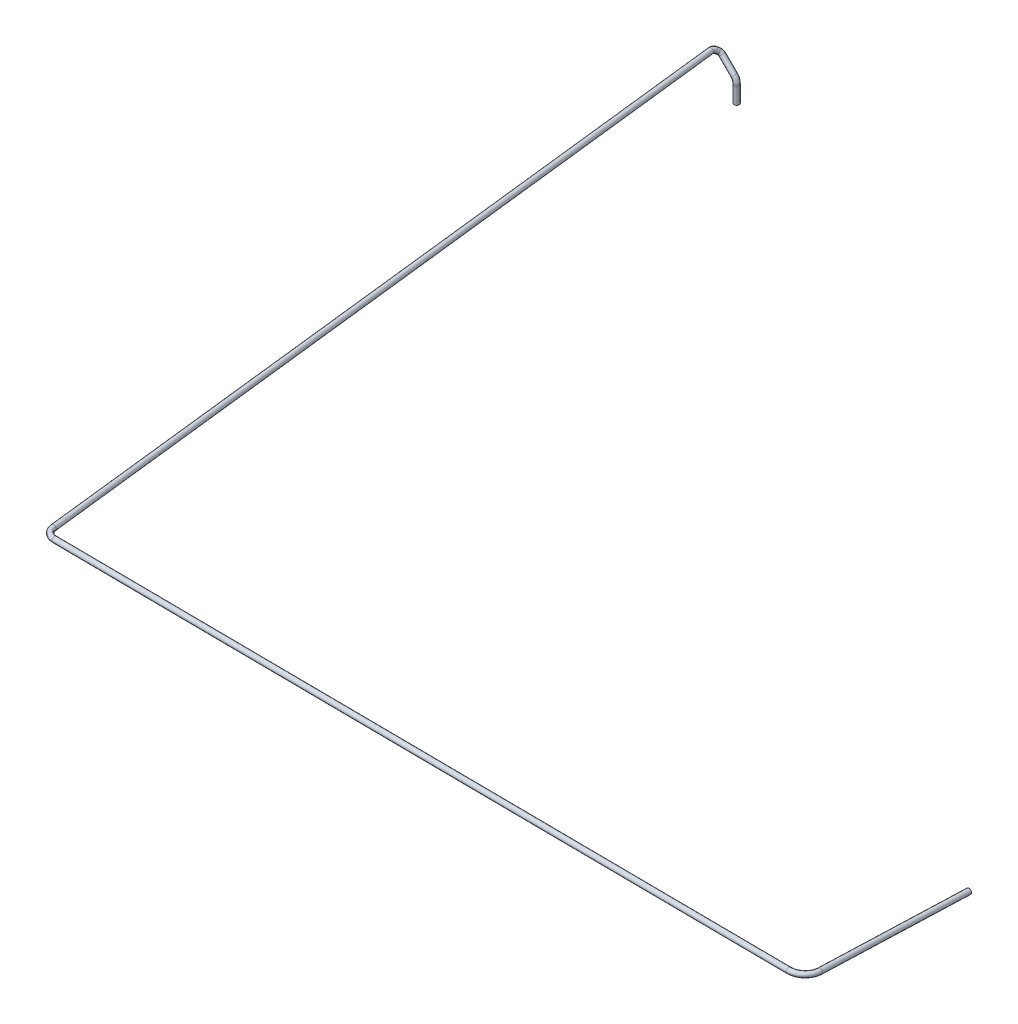
ISO-10303-21;
HEADER;
FILE_DESCRIPTION(('STEP AP214'),'2;1');
FILE_NAME('part.step','',(''),(''),'','','');
FILE_SCHEMA(('AUTOMOTIVE_DESIGN { 1 0 10303 214 1 1 1 1 }'));
ENDSEC;
DATA;
#1=APPLICATION_CONTEXT('core data for automotive mechanical design processes');
#2=APPLICATION_PROTOCOL_DEFINITION('international standard','automotive_design',2000,#1);
#3=PRODUCT_CONTEXT('',#1,'mechanical');
#4=PRODUCT('Part','Part','',(#3));
#5=PRODUCT_RELATED_PRODUCT_CATEGORY('part','',(#4));
#6=PRODUCT_DEFINITION_FORMATION('','',#4);
#7=PRODUCT_DEFINITION_CONTEXT('part definition',#1,'design');
#8=PRODUCT_DEFINITION('design','',#6,#7);
#9=PRODUCT_DEFINITION_SHAPE('','',#8);
#10=(LENGTH_UNIT() NAMED_UNIT(*) SI_UNIT(.MILLI.,.METRE.));
#11=(NAMED_UNIT(*) PLANE_ANGLE_UNIT() SI_UNIT($,.RADIAN.));
#12=(NAMED_UNIT(*) SI_UNIT($,.STERADIAN.) SOLID_ANGLE_UNIT());
#13=UNCERTAINTY_MEASURE_WITH_UNIT(LENGTH_MEASURE(1.E-05),#10,'distance_accuracy_value','');
#14=(GEOMETRIC_REPRESENTATION_CONTEXT(3) GLOBAL_UNCERTAINTY_ASSIGNED_CONTEXT((#13)) GLOBAL_UNIT_ASSIGNED_CONTEXT((#10,
#11,#12)) REPRESENTATION_CONTEXT('',''));
#15=CARTESIAN_POINT('',(0.,0.,0.));
#16=DIRECTION('',(0.,0.,1.));
#17=DIRECTION('',(1.,0.,0.));
#18=AXIS2_PLACEMENT_3D('',#15,#16,#17);
#19=CARTESIAN_POINT('',(77.9840928608775,2.00545645415392,69.9909604922563));
#20=DIRECTION('',(0.00454389115413945,-0.0313134335197666,-0.999499285609741));
#21=DIRECTION('',(0.,0.999509604073824,-0.0313137567881708));
#22=AXIS2_PLACEMENT_3D('',#19,#20,#21);
#23=CYLINDRICAL_SURFACE('',#22,0.25);
#24=CARTESIAN_POINT('',(77.9840928608775,2.00545645415392,69.9909604922563));
#25=DIRECTION('',(0.00454389115415026,-0.0313134335197787,-0.999499285609741));
#26=DIRECTION('',(-0.733470039390503,-0.679484646398491,0.0179531786938116));
#27=AXIS2_PLACEMENT_3D('',#24,#25,#26);
#28=CIRCLE('',#27,0.25);
#29=CARTESIAN_POINT('',(78.2340846303666,2.00381213147996,69.9921485118935));
#30=VERTEX_POINT('',#29);
#31=EDGE_CURVE('E37',#30,#30,#28,.T.);
#32=ORIENTED_EDGE('',*,*,#31,.T.);
#33=EDGE_LOOP('',(#32));
#34=FACE_BOUND('',#33,.T.);
#35=CARTESIAN_POINT('',(78.0486372325958,1.56066017177983,55.7934255526867));
#36=DIRECTION('',(0.00454389115415026,-0.0313134335197787,-0.999499285609741));
#37=DIRECTION('',(-0.733470039390503,-0.679484646398491,0.0179531786938116));
#38=AXIS2_PLACEMENT_3D('',#35,#36,#37);
#39=CIRCLE('',#38,0.25);
#40=CARTESIAN_POINT('',(77.8652697227481,1.3907890101802,55.7979138473602));
#41=VERTEX_POINT('',#40);
#42=EDGE_CURVE('E10',#41,#41,#39,.T.);
#43=ORIENTED_EDGE('',*,*,#42,.F.);
#44=EDGE_LOOP('',(#43));
#45=FACE_BOUND('',#44,.T.);
#46=ADVANCED_FACE('F31',(#34,#45),#23,.T.);
#47=CARTESIAN_POINT('',(76.484142243943,2.01532239019766,69.9838323744328));
#48=DIRECTION('',(0.00672280124745335,0.999487972978317,-0.031282516124535));
#49=DIRECTION('',(0.,0.0312832230716834,0.999510560201465));
#50=AXIS2_PLACEMENT_3D('',#47,#48,#49);
#51=TOROIDAL_SURFACE('',#50,1.49999999999998,0.25);
#52=CARTESIAN_POINT('',(76.4819808971659,2.06226169961191,71.4830962037209));
#53=DIRECTION('',(0.999976363599045,-0.0066744269176034,0.00165053583804409));
#54=DIRECTION('',(-0.00355236882022048,-0.707087883335913,-0.707116755504566));
#55=AXIS2_PLACEMENT_3D('',#52,#53,#54);
#56=CIRCLE('',#55,0.25);
#57=CARTESIAN_POINT('',(76.4816206727031,2.07008491784762,71.7329735086023));
#58=VERTEX_POINT('',#57);
#59=EDGE_CURVE('E41',#58,#58,#56,.T.);
#60=CARTESIAN_POINT('',(76.484142243943,2.01532239019766,69.9838323744328));
#61=DIRECTION('',(0.00672280124745335,0.999487972978317,-0.031282516124535));
#62=DIRECTION('',(0.,0.0312832230716834,0.999510560201465));
#63=AXIS2_PLACEMENT_3D('',#60,#61,#62);
#64=CIRCLE('',#63,1.74999999999998);
#65=EDGE_CURVE('',#58,#30,#64,.T.);
#66=ORIENTED_EDGE('',*,*,#59,.T.);
#67=ORIENTED_EDGE('',*,*,#31,.F.);
#68=ORIENTED_EDGE('',*,*,#65,.T.);
#69=ORIENTED_EDGE('',*,*,#65,.F.);
#70=EDGE_LOOP('',(#66,#68,#67,#69));
#71=FACE_BOUND('',#70,.T.);
#72=ADVANCED_FACE('F96',(#71),#51,.T.);
#73=CARTESIAN_POINT('',(6.03178913214784,2.53248747032256,71.3668128888966));
#74=DIRECTION('',(0.999976363599045,-0.00667442691758972,0.00165053583804397));
#75=DIRECTION('',(0.00667443600907397,0.999977725703908,0.));
#76=AXIS2_PLACEMENT_3D('',#73,#74,#75);
#77=CYLINDRICAL_SURFACE('',#76,0.25);
#78=CARTESIAN_POINT('',(6.03178913214784,2.53248747032256,71.3668128888966));
#79=DIRECTION('',(0.999976363599045,-0.0066744269176034,0.00165053583804409));
#80=DIRECTION('',(-0.00355236882022048,-0.707087883335913,-0.707116755504566));
#81=AXIS2_PLACEMENT_3D('',#78,#79,#80);
#82=CIRCLE('',#81,0.25);
#83=CARTESIAN_POINT('',(6.03134763128262,2.52815465030683,71.6167749495132));
#84=VERTEX_POINT('',#83);
#85=EDGE_CURVE('E45',#84,#84,#82,.T.);
#86=ORIENTED_EDGE('',*,*,#85,.T.);
#87=EDGE_LOOP('',(#86));
#88=FACE_BOUND('',#87,.T.);
#89=ORIENTED_EDGE('',*,*,#59,.F.);
#90=EDGE_LOOP('',(#89));
#91=FACE_BOUND('',#90,.T.);
#92=ADVANCED_FACE('F100',(#88,#91),#77,.T.);
#93=CARTESIAN_POINT('',(6.03355513560876,2.54981875038549,70.3669646464302));
#94=DIRECTION('',(0.00664480812416663,0.999827524504453,0.0173426574748836));
#95=DIRECTION('',(0.,-0.0173430403568595,0.999849598165234));
#96=AXIS2_PLACEMENT_3D('',#93,#94,#95);
#97=TOROIDAL_SURFACE('',#96,0.999999999999997,0.25);
#98=CARTESIAN_POINT('',(5.03833211763403,2.55474169774906,70.464468026282));
#99=DIRECTION('',(0.0974011859181519,-0.0179077031624352,0.995084078432161));
#100=DIRECTION('',(0.68665033584127,-0.722548972980984,-0.0802140756550598));
#101=AXIS2_PLACEMENT_3D('',#98,#99,#100);
#102=CIRCLE('',#101,0.25);
#103=CARTESIAN_POINT('',(4.78952636314034,2.55597243458995,70.488843871245));
#104=VERTEX_POINT('',#103);
#105=EDGE_CURVE('E50',#104,#104,#102,.T.);
#106=CARTESIAN_POINT('',(6.03355513560876,2.54981875038549,70.3669646464302));
#107=DIRECTION('',(0.00664480812416663,0.999827524504453,0.0173426574748836));
#108=DIRECTION('',(0.,-0.0173430403568595,0.999849598165234));
#109=AXIS2_PLACEMENT_3D('',#106,#107,#108);
#110=CIRCLE('',#109,1.25);
#111=EDGE_CURVE('',#104,#84,#110,.T.);
#112=ORIENTED_EDGE('',*,*,#105,.T.);
#113=ORIENTED_EDGE('',*,*,#85,.F.);
#114=ORIENTED_EDGE('',*,*,#111,.T.);
#115=ORIENTED_EDGE('',*,*,#111,.F.);
#116=EDGE_LOOP('',(#112,#114,#113,#115));
#117=FACE_BOUND('',#116,.T.);
#118=ADVANCED_FACE('F106',(#117),#97,.T.);
#119=CARTESIAN_POINT('',(-1.79265337637931,3.81065310560931,0.676766356963938));
#120=DIRECTION('',(0.0974011859181513,-0.0179077031624398,0.995084078432161));
#121=DIRECTION('',(0.995243671500691,0.,-0.0974168072656093));
#122=AXIS2_PLACEMENT_3D('',#119,#120,#121);
#123=CYLINDRICAL_SURFACE('',#122,0.25);
#124=CARTESIAN_POINT('',(-1.79265337637931,3.81065310560931,0.676766356963938));
#125=DIRECTION('',(0.0974011859181519,-0.0179077031624352,0.995084078432161));
#126=DIRECTION('',(0.68665033584127,-0.722548972980984,-0.0802140756550598));
#127=AXIS2_PLACEMENT_3D('',#124,#125,#126);
#128=CIRCLE('',#127,0.25);
#129=CARTESIAN_POINT('',(-1.97730535703384,3.97786297391649,0.697849667450042));
#130=VERTEX_POINT('',#129);
#131=EDGE_CURVE('E53',#130,#130,#128,.T.);
#132=ORIENTED_EDGE('',*,*,#131,.T.);
#133=EDGE_LOOP('',(#132));
#134=FACE_BOUND('',#133,.T.);
#135=ORIENTED_EDGE('',*,*,#105,.F.);
#136=EDGE_LOOP('',(#135));
#137=FACE_BOUND('',#136,.T.);
#138=ADVANCED_FACE('F113',(#134,#137),#123,.T.);
#139=CARTESIAN_POINT('',(-1.42334941507025,3.47623336899494,0.634599735991732));
#140=DIRECTION('',(0.667061725500324,0.743191141778862,-0.0519189864496811));
#141=DIRECTION('',(-0.744194837410347,0.667962606716714,0.));
#142=AXIS2_PLACEMENT_3D('',#139,#140,#141);
#143=TOROIDAL_SURFACE('',#142,0.5,0.25);
#144=CARTESIAN_POINT('',(-1.70355864945063,3.70355864945064,0.288469699973908));
#145=DIRECTION('',(-0.490876557032795,0.490876557032822,0.71977802933351));
#146=DIRECTION('',(0.50895992549081,-0.508959925490819,0.694204284406808));
#147=AXIS2_PLACEMENT_3D('',#144,#145,#146);
#148=CIRCLE('',#147,0.25);
#149=CARTESIAN_POINT('',(-1.84366326664082,3.81722128967848,0.115404681964995));
#150=VERTEX_POINT('',#149);
#151=EDGE_CURVE('E56',#150,#150,#148,.T.);
#152=CARTESIAN_POINT('',(-1.42334941507025,3.47623336899494,0.634599735991732));
#153=DIRECTION('',(0.667061725500324,0.743191141778862,-0.0519189864496811));
#154=DIRECTION('',(-0.744194837410347,0.667962606716714,0.));
#155=AXIS2_PLACEMENT_3D('',#152,#153,#154);
#156=CIRCLE('',#155,0.75);
#157=EDGE_CURVE('',#150,#130,#156,.T.);
#158=ORIENTED_EDGE('',*,*,#151,.T.);
#159=ORIENTED_EDGE('',*,*,#131,.F.);
#160=ORIENTED_EDGE('',*,*,#157,.T.);
#161=ORIENTED_EDGE('',*,*,#157,.F.);
#162=EDGE_LOOP('',(#158,#160,#159,#161));
#163=FACE_BOUND('',#162,.T.);
#164=ADVANCED_FACE('F117',(#163),#143,.T.);
#165=CARTESIAN_POINT('',(-1.61110092442085,3.61110092442085,0.152897857796596));
#166=DIRECTION('',(-0.490876557032797,0.490876557032826,0.719778029333507));
#167=DIRECTION('',(0.,-0.82616386479575,0.563429914457646));
#168=AXIS2_PLACEMENT_3D('',#165,#166,#167);
#169=CYLINDRICAL_SURFACE('',#168,0.25);
#170=CARTESIAN_POINT('',(-1.61110092442085,3.61110092442085,0.152897857796596));
#171=DIRECTION('',(-0.490876557032795,0.490876557032822,0.71977802933351));
#172=DIRECTION('',(0.50895992549081,-0.508959925490819,0.694204284406808));
#173=AXIS2_PLACEMENT_3D('',#170,#171,#172);
#174=CIRCLE('',#173,0.25);
#175=CARTESIAN_POINT('',(-1.73834090579356,3.73834090579355,-0.0206532133051062));
#176=VERTEX_POINT('',#175);
#177=EDGE_CURVE('E59',#176,#176,#174,.T.);
#178=ORIENTED_EDGE('',*,*,#177,.T.);
#179=EDGE_LOOP('',(#178));
#180=FACE_BOUND('',#179,.T.);
#181=ORIENTED_EDGE('',*,*,#151,.F.);
#182=EDGE_LOOP('',(#181));
#183=FACE_BOUND('',#182,.T.);
#184=ADVANCED_FACE('F121',(#180,#183),#169,.T.);
#185=CARTESIAN_POINT('',(-1.35662096167544,3.35662096167545,0.5));
#186=DIRECTION('',(0.707106781186546,0.70710678118655,0.));
#187=DIRECTION('',(-0.70710678118655,0.707106781186546,0.));
#188=AXIS2_PLACEMENT_3D('',#185,#186,#187);
#189=TOROIDAL_SURFACE('',#188,0.5,0.25);
#190=CARTESIAN_POINT('',(-1.35662096167545,3.35662096167544,0.));
#191=DIRECTION('',(-0.707106781186549,0.707106781186546,0.));
#192=DIRECTION('',(0.,0.,1.));
#193=AXIS2_PLACEMENT_3D('',#190,#191,#192);
#194=CIRCLE('',#193,0.25);
#195=CARTESIAN_POINT('',(-1.35662096167545,3.35662096167544,-0.25));
#196=VERTEX_POINT('',#195);
#197=EDGE_CURVE('E62',#196,#196,#194,.T.);
#198=CARTESIAN_POINT('',(-1.35662096167544,3.35662096167545,0.5));
#199=DIRECTION('',(0.707106781186546,0.70710678118655,0.));
#200=DIRECTION('',(-0.70710678118655,0.707106781186546,0.));
#201=AXIS2_PLACEMENT_3D('',#198,#199,#200);
#202=CIRCLE('',#201,0.75);
#203=EDGE_CURVE('',#196,#176,#202,.T.);
#204=ORIENTED_EDGE('',*,*,#197,.T.);
#205=ORIENTED_EDGE('',*,*,#177,.F.);
#206=ORIENTED_EDGE('',*,*,#203,.T.);
#207=ORIENTED_EDGE('',*,*,#203,.F.);
#208=EDGE_LOOP('',(#204,#206,#205,#207));
#209=FACE_BOUND('',#208,.T.);
#210=ADVANCED_FACE('F125',(#209),#189,.T.);
#211=CARTESIAN_POINT('',(-0.21966991411009,2.21966991411009,0.));
#212=DIRECTION('',(-0.707106781186549,0.707106781186546,0.));
#213=DIRECTION('',(-0.707106781186546,-0.707106781186549,0.));
#214=AXIS2_PLACEMENT_3D('',#211,#212,#213);
#215=CYLINDRICAL_SURFACE('',#214,0.25);
#216=CARTESIAN_POINT('',(-0.21966991411009,2.21966991411009,0.));
#217=DIRECTION('',(-0.707106781186549,0.707106781186546,0.));
#218=DIRECTION('',(0.,0.,1.));
#219=AXIS2_PLACEMENT_3D('',#216,#217,#218);
#220=CIRCLE('',#219,0.25);
#221=CARTESIAN_POINT('',(-0.0428932188134538,2.39644660940673,0.));
#222=VERTEX_POINT('',#221);
#223=EDGE_CURVE('E65',#222,#222,#220,.T.);
#224=ORIENTED_EDGE('',*,*,#223,.T.);
#225=EDGE_LOOP('',(#224));
#226=FACE_BOUND('',#225,.T.);
#227=ORIENTED_EDGE('',*,*,#197,.F.);
#228=EDGE_LOOP('',(#227));
#229=FACE_BOUND('',#228,.T.);
#230=ADVANCED_FACE('F129',(#226,#229),#215,.T.);
#231=CARTESIAN_POINT('',(-0.75,1.68933982822018,0.));
#232=DIRECTION('',(0.,0.,1.));
#233=DIRECTION('',(1.,0.,0.));
#234=AXIS2_PLACEMENT_3D('',#231,#232,#233);
#235=TOROIDAL_SURFACE('',#234,0.75,0.25);
#236=CARTESIAN_POINT('',(0.,1.68933982822018,0.));
#237=DIRECTION('',(0.,1.,0.));
#238=DIRECTION('',(0.,0.,1.));
#239=AXIS2_PLACEMENT_3D('',#236,#237,#238);
#240=CIRCLE('',#239,0.25);
#241=CARTESIAN_POINT('',(0.25,1.68933982822018,0.));
#242=VERTEX_POINT('',#241);
#243=EDGE_CURVE('E68',#242,#242,#240,.T.);
#244=CARTESIAN_POINT('',(-0.75,1.68933982822018,0.));
#245=DIRECTION('',(0.,0.,1.));
#246=DIRECTION('',(1.,0.,0.));
#247=AXIS2_PLACEMENT_3D('',#244,#245,#246);
#248=CIRCLE('',#247,1.);
#249=EDGE_CURVE('',#242,#222,#248,.T.);
#250=ORIENTED_EDGE('',*,*,#243,.T.);
#251=ORIENTED_EDGE('',*,*,#223,.F.);
#252=ORIENTED_EDGE('',*,*,#249,.T.);
#253=ORIENTED_EDGE('',*,*,#249,.F.);
#254=EDGE_LOOP('',(#250,#252,#251,#253));
#255=FACE_BOUND('',#254,.T.);
#256=ADVANCED_FACE('F133',(#255),#235,.T.);
#257=CARTESIAN_POINT('',(0.,1.54406466651835,0.));
#258=DIRECTION('',(0.,1.,0.));
#259=DIRECTION('',(0.,0.,1.));
#260=AXIS2_PLACEMENT_3D('',#257,#258,#259);
#261=CYLINDRICAL_SURFACE('',#260,0.25);
#262=CARTESIAN_POINT('',(0.,1.54406466651835,0.));
#263=DIRECTION('',(0.,1.,0.));
#264=DIRECTION('',(0.,0.,1.));
#265=AXIS2_PLACEMENT_3D('',#262,#263,#264);
#266=CIRCLE('',#265,0.25);
#267=CARTESIAN_POINT('',(0.,1.54406466651835,0.25));
#268=VERTEX_POINT('',#267);
#269=EDGE_CURVE('E71',#268,#268,#266,.T.);
#270=ORIENTED_EDGE('',*,*,#269,.T.);
#271=EDGE_LOOP('',(#270));
#272=FACE_BOUND('',#271,.T.);
#273=ORIENTED_EDGE('',*,*,#243,.F.);
#274=EDGE_LOOP('',(#273));
#275=FACE_BOUND('',#274,.T.);
#276=ADVANCED_FACE('F78',(#272,#275),#261,.T.);
#277=CARTESIAN_POINT('',(0.,1.54406466651835,0.));
#278=DIRECTION('',(0.,-1.,0.));
#279=DIRECTION('',(0.,0.,-1.));
#280=AXIS2_PLACEMENT_3D('',#277,#278,#279);
#281=CYLINDRICAL_SURFACE('',#280,0.25);
#282=ORIENTED_EDGE('',*,*,#269,.F.);
#283=EDGE_LOOP('',(#282));
#284=FACE_BOUND('',#283,.T.);
#285=CARTESIAN_POINT('',(0.,0.,0.));
#286=DIRECTION('',(0.,1.,0.));
#287=DIRECTION('',(0.,0.,1.));
#288=AXIS2_PLACEMENT_3D('',#285,#286,#287);
#289=CIRCLE('',#288,0.25);
#290=CARTESIAN_POINT('',(0.,0.,0.25));
#291=VERTEX_POINT('',#290);
#292=EDGE_CURVE('E72',#291,#291,#289,.T.);
#293=ORIENTED_EDGE('',*,*,#292,.T.);
#294=EDGE_LOOP('',(#293));
#295=FACE_BOUND('',#294,.T.);
#296=ADVANCED_FACE('F81',(#284,#295),#281,.T.);
#297=CARTESIAN_POINT('',(78.0486372325958,1.56066017177983,55.7934255526867));
#298=DIRECTION('',(0.00454389115415026,-0.0313134335197787,-0.999499285609741));
#299=DIRECTION('',(-0.733470039390503,-0.679484646398491,0.0179531786938116));
#300=AXIS2_PLACEMENT_3D('',#297,#298,#299);
#301=PLANE('',#300);
#302=ORIENTED_EDGE('',*,*,#42,.T.);
#303=EDGE_LOOP('',(#302));
#304=FACE_BOUND('',#303,.T.);
#305=ADVANCED_FACE('F84',(#304),#301,.T.);
#306=CARTESIAN_POINT('',(0.,0.,0.));
#307=DIRECTION('',(0.,1.,0.));
#308=DIRECTION('',(0.,0.,1.));
#309=AXIS2_PLACEMENT_3D('',#306,#307,#308);
#310=PLANE('',#309);
#311=ORIENTED_EDGE('',*,*,#292,.F.);
#312=EDGE_LOOP('',(#311));
#313=FACE_BOUND('',#312,.T.);
#314=ADVANCED_FACE('F88',(#313),#310,.F.);
#315=CLOSED_SHELL('',(#46,#72,#92,#118,#138,#164,#184,#210,#230,#256,#276,#296,#305,#314));
#316=MANIFOLD_SOLID_BREP('B2',#315);
#317=ADVANCED_BREP_SHAPE_REPRESENTATION('',(#18,#316),#14);
#318=SHAPE_DEFINITION_REPRESENTATION(#9,#317);
ENDSEC;
END-ISO-10303-21;
